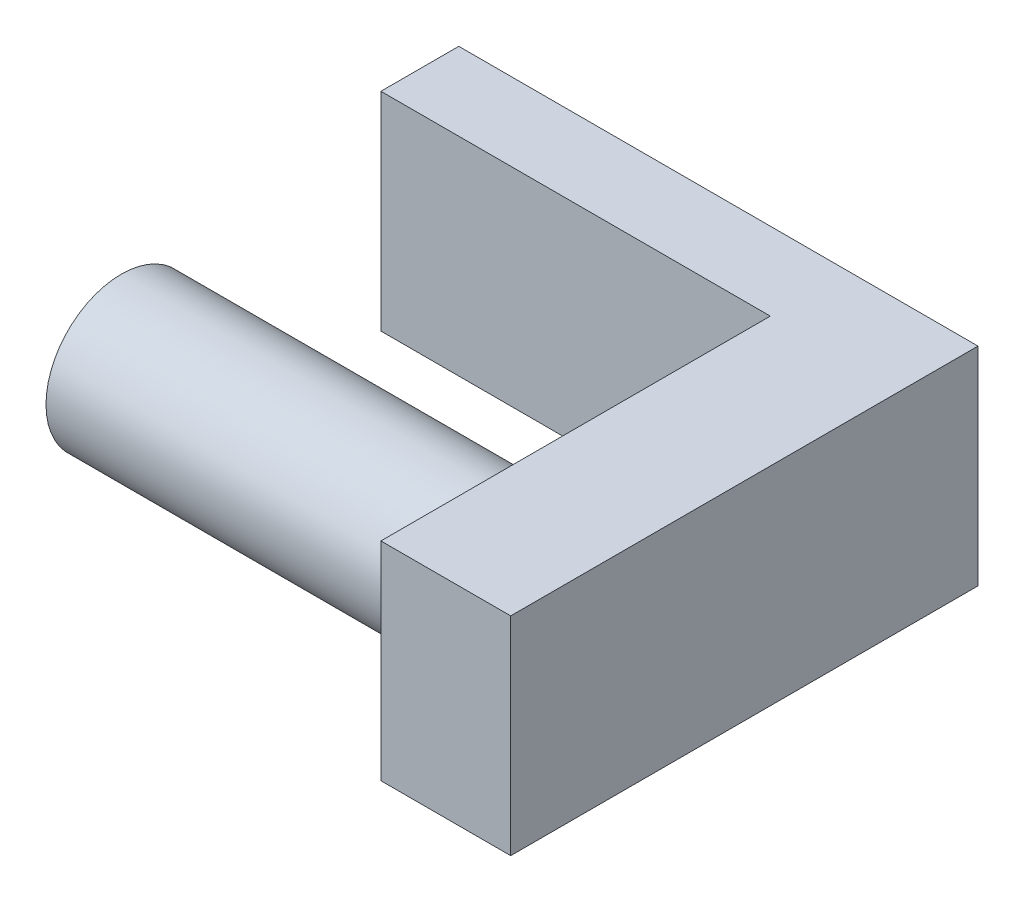
ISO-10303-21;
HEADER;
FILE_DESCRIPTION(('STEP AP214'),'2;1');
FILE_NAME('part.step','',(''),(''),'','','');
FILE_SCHEMA(('AUTOMOTIVE_DESIGN { 1 0 10303 214 1 1 1 1 }'));
ENDSEC;
DATA;
#1=APPLICATION_CONTEXT('core data for automotive mechanical design processes');
#2=APPLICATION_PROTOCOL_DEFINITION('international standard','automotive_design',2000,#1);
#3=PRODUCT_CONTEXT('',#1,'mechanical');
#4=PRODUCT('Part','Part','',(#3));
#5=PRODUCT_RELATED_PRODUCT_CATEGORY('part','',(#4));
#6=PRODUCT_DEFINITION_FORMATION('','',#4);
#7=PRODUCT_DEFINITION_CONTEXT('part definition',#1,'design');
#8=PRODUCT_DEFINITION('design','',#6,#7);
#9=PRODUCT_DEFINITION_SHAPE('','',#8);
#10=(LENGTH_UNIT() NAMED_UNIT(*) SI_UNIT(.MILLI.,.METRE.));
#11=(NAMED_UNIT(*) PLANE_ANGLE_UNIT() SI_UNIT($,.RADIAN.));
#12=(NAMED_UNIT(*) SI_UNIT($,.STERADIAN.) SOLID_ANGLE_UNIT());
#13=UNCERTAINTY_MEASURE_WITH_UNIT(LENGTH_MEASURE(1.E-05),#10,'distance_accuracy_value','');
#14=(GEOMETRIC_REPRESENTATION_CONTEXT(3) GLOBAL_UNCERTAINTY_ASSIGNED_CONTEXT((#13)) GLOBAL_UNIT_ASSIGNED_CONTEXT((#10,
#11,#12)) REPRESENTATION_CONTEXT('',''));
#15=CARTESIAN_POINT('',(0.,0.,0.));
#16=DIRECTION('',(0.,0.,1.));
#17=DIRECTION('',(1.,0.,0.));
#18=AXIS2_PLACEMENT_3D('',#15,#16,#17);
#19=CARTESIAN_POINT('',(0.,0.,3.));
#20=DIRECTION('',(0.,0.,-1.));
#21=DIRECTION('',(-1.,0.,0.));
#22=AXIS2_PLACEMENT_3D('',#19,#20,#21);
#23=PLANE('',#22);
#24=DIRECTION('',(0.,-1.,0.));
#25=VECTOR('',#24,1.);
#26=CARTESIAN_POINT('',(15.,8.,3.));
#27=LINE('',#26,#25);
#28=CARTESIAN_POINT('',(15.,8.,3.));
#29=VERTEX_POINT('',#28);
#30=CARTESIAN_POINT('',(15.,0.,3.));
#31=VERTEX_POINT('',#30);
#32=EDGE_CURVE('E52',#29,#31,#27,.T.);
#33=ORIENTED_EDGE('',*,*,#32,.F.);
#34=DIRECTION('',(-1.,0.,0.));
#35=VECTOR('',#34,1.);
#36=CARTESIAN_POINT('',(0.,8.,3.));
#37=LINE('',#36,#35);
#38=CARTESIAN_POINT('',(0.,8.,3.));
#39=VERTEX_POINT('',#38);
#40=EDGE_CURVE('E57',#29,#39,#37,.T.);
#41=ORIENTED_EDGE('',*,*,#40,.T.);
#42=DIRECTION('',(0.,-1.,0.));
#43=VECTOR('',#42,1.);
#44=CARTESIAN_POINT('',(0.,0.,3.));
#45=LINE('',#44,#43);
#46=CARTESIAN_POINT('',(0.,0.,3.));
#47=VERTEX_POINT('',#46);
#48=EDGE_CURVE('E88',#39,#47,#45,.T.);
#49=ORIENTED_EDGE('',*,*,#48,.T.);
#50=DIRECTION('',(1.,0.,0.));
#51=VECTOR('',#50,1.);
#52=CARTESIAN_POINT('',(0.,0.,3.));
#53=LINE('',#52,#51);
#54=EDGE_CURVE('E116',#47,#31,#53,.T.);
#55=ORIENTED_EDGE('',*,*,#54,.T.);
#56=EDGE_LOOP('',(#33,#41,#49,#55));
#57=FACE_BOUND('',#56,.T.);
#58=ADVANCED_FACE('F37',(#57),#23,.F.);
#59=CARTESIAN_POINT('',(0.,0.,3.));
#60=DIRECTION('',(1.,0.,0.));
#61=DIRECTION('',(0.,0.,-1.));
#62=AXIS2_PLACEMENT_3D('',#59,#60,#61);
#63=PLANE('',#62);
#64=DIRECTION('',(0.,-1.,0.));
#65=VECTOR('',#64,1.);
#66=CARTESIAN_POINT('',(0.,0.,0.));
#67=LINE('',#66,#65);
#68=CARTESIAN_POINT('',(0.,8.,0.));
#69=VERTEX_POINT('',#68);
#70=CARTESIAN_POINT('',(0.,0.,0.));
#71=VERTEX_POINT('',#70);
#72=EDGE_CURVE('E94',#69,#71,#67,.T.);
#73=ORIENTED_EDGE('',*,*,#72,.T.);
#74=DIRECTION('',(0.,0.,-1.));
#75=VECTOR('',#74,1.);
#76=CARTESIAN_POINT('',(0.,0.,3.));
#77=LINE('',#76,#75);
#78=EDGE_CURVE('E45',#47,#71,#77,.T.);
#79=ORIENTED_EDGE('',*,*,#78,.F.);
#80=ORIENTED_EDGE('',*,*,#48,.F.);
#81=DIRECTION('',(0.,0.,-1.));
#82=VECTOR('',#81,1.);
#83=CARTESIAN_POINT('',(0.,8.,3.));
#84=LINE('',#83,#82);
#85=EDGE_CURVE('E80',#39,#69,#84,.T.);
#86=ORIENTED_EDGE('',*,*,#85,.T.);
#87=EDGE_LOOP('',(#73,#79,#80,#86));
#88=FACE_BOUND('',#87,.T.);
#89=ADVANCED_FACE('F39',(#88),#63,.F.);
#90=CARTESIAN_POINT('',(0.,0.,3.));
#91=DIRECTION('',(0.,1.,0.));
#92=DIRECTION('',(0.,0.,1.));
#93=AXIS2_PLACEMENT_3D('',#90,#91,#92);
#94=PLANE('',#93);
#95=DIRECTION('',(1.,0.,0.));
#96=VECTOR('',#95,1.);
#97=CARTESIAN_POINT('',(0.,0.,0.));
#98=LINE('',#97,#96);
#99=CARTESIAN_POINT('',(20.,0.,0.));
#100=VERTEX_POINT('',#99);
#101=EDGE_CURVE('E97',#71,#100,#98,.T.);
#102=ORIENTED_EDGE('',*,*,#101,.T.);
#103=DIRECTION('',(0.,0.,-1.));
#104=VECTOR('',#103,1.);
#105=CARTESIAN_POINT('',(20.,0.,3.));
#106=LINE('',#105,#104);
#107=CARTESIAN_POINT('',(20.,0.,18.));
#108=VERTEX_POINT('',#107);
#109=EDGE_CURVE('E110',#108,#100,#106,.T.);
#110=ORIENTED_EDGE('',*,*,#109,.F.);
#111=DIRECTION('',(1.,0.,0.));
#112=VECTOR('',#111,1.);
#113=CARTESIAN_POINT('',(20.,0.,18.));
#114=LINE('',#113,#112);
#115=CARTESIAN_POINT('',(15.,0.,18.));
#116=VERTEX_POINT('',#115);
#117=EDGE_CURVE('E123',#116,#108,#114,.T.);
#118=ORIENTED_EDGE('',*,*,#117,.F.);
#119=DIRECTION('',(0.,0.,-1.));
#120=VECTOR('',#119,1.);
#121=CARTESIAN_POINT('',(15.,0.,18.));
#122=LINE('',#121,#120);
#123=EDGE_CURVE('E103',#116,#31,#122,.T.);
#124=ORIENTED_EDGE('',*,*,#123,.T.);
#125=ORIENTED_EDGE('',*,*,#54,.F.);
#126=ORIENTED_EDGE('',*,*,#78,.T.);
#127=EDGE_LOOP('',(#102,#110,#118,#124,#125,#126));
#128=FACE_BOUND('',#127,.T.);
#129=ADVANCED_FACE('F113',(#128),#94,.F.);
#130=CARTESIAN_POINT('',(20.,0.,3.));
#131=DIRECTION('',(-1.,0.,0.));
#132=DIRECTION('',(0.,0.,1.));
#133=AXIS2_PLACEMENT_3D('',#130,#131,#132);
#134=PLANE('',#133);
#135=DIRECTION('',(0.,1.,0.));
#136=VECTOR('',#135,1.);
#137=CARTESIAN_POINT('',(20.,0.,0.));
#138=LINE('',#137,#136);
#139=CARTESIAN_POINT('',(20.,8.,0.));
#140=VERTEX_POINT('',#139);
#141=EDGE_CURVE('E89',#100,#140,#138,.T.);
#142=ORIENTED_EDGE('',*,*,#141,.T.);
#143=DIRECTION('',(0.,0.,-1.));
#144=VECTOR('',#143,1.);
#145=CARTESIAN_POINT('',(20.,8.,3.));
#146=LINE('',#145,#144);
#147=CARTESIAN_POINT('',(20.,8.,18.));
#148=VERTEX_POINT('',#147);
#149=EDGE_CURVE('E84',#148,#140,#146,.T.);
#150=ORIENTED_EDGE('',*,*,#149,.F.);
#151=DIRECTION('',(0.,1.,0.));
#152=VECTOR('',#151,1.);
#153=CARTESIAN_POINT('',(20.,8.,18.));
#154=LINE('',#153,#152);
#155=EDGE_CURVE('E125',#108,#148,#154,.T.);
#156=ORIENTED_EDGE('',*,*,#155,.F.);
#157=ORIENTED_EDGE('',*,*,#109,.T.);
#158=EDGE_LOOP('',(#142,#150,#156,#157));
#159=FACE_BOUND('',#158,.T.);
#160=ADVANCED_FACE('F165',(#159),#134,.F.);
#161=CARTESIAN_POINT('',(0.,8.,3.));
#162=DIRECTION('',(0.,-1.,0.));
#163=DIRECTION('',(0.,0.,-1.));
#164=AXIS2_PLACEMENT_3D('',#161,#162,#163);
#165=PLANE('',#164);
#166=DIRECTION('',(-1.,0.,0.));
#167=VECTOR('',#166,1.);
#168=CARTESIAN_POINT('',(0.,8.,0.));
#169=LINE('',#168,#167);
#170=EDGE_CURVE('E77',#140,#69,#169,.T.);
#171=ORIENTED_EDGE('',*,*,#170,.T.);
#172=ORIENTED_EDGE('',*,*,#85,.F.);
#173=ORIENTED_EDGE('',*,*,#40,.F.);
#174=DIRECTION('',(0.,0.,-1.));
#175=VECTOR('',#174,1.);
#176=CARTESIAN_POINT('',(15.,8.,18.));
#177=LINE('',#176,#175);
#178=CARTESIAN_POINT('',(15.,8.,18.));
#179=VERTEX_POINT('',#178);
#180=EDGE_CURVE('E99',#179,#29,#177,.T.);
#181=ORIENTED_EDGE('',*,*,#180,.F.);
#182=DIRECTION('',(-1.,0.,0.));
#183=VECTOR('',#182,1.);
#184=CARTESIAN_POINT('',(20.,8.,18.));
#185=LINE('',#184,#183);
#186=EDGE_CURVE('E132',#148,#179,#185,.T.);
#187=ORIENTED_EDGE('',*,*,#186,.F.);
#188=ORIENTED_EDGE('',*,*,#149,.T.);
#189=EDGE_LOOP('',(#171,#172,#173,#181,#187,#188));
#190=FACE_BOUND('',#189,.T.);
#191=ADVANCED_FACE('F79',(#190),#165,.F.);
#192=CARTESIAN_POINT('',(0.,0.,0.));
#193=DIRECTION('',(0.,0.,-1.));
#194=DIRECTION('',(-1.,0.,0.));
#195=AXIS2_PLACEMENT_3D('',#192,#193,#194);
#196=PLANE('',#195);
#197=ORIENTED_EDGE('',*,*,#72,.F.);
#198=ORIENTED_EDGE('',*,*,#170,.F.);
#199=ORIENTED_EDGE('',*,*,#141,.F.);
#200=ORIENTED_EDGE('',*,*,#101,.F.);
#201=EDGE_LOOP('',(#197,#198,#199,#200));
#202=FACE_BOUND('',#201,.T.);
#203=ADVANCED_FACE('F96',(#202),#196,.T.);
#204=CARTESIAN_POINT('',(15.,8.,18.));
#205=DIRECTION('',(1.,0.,0.));
#206=DIRECTION('',(0.,1.,0.));
#207=AXIS2_PLACEMENT_3D('',#204,#205,#206);
#208=PLANE('',#207);
#209=CARTESIAN_POINT('',(15.,4.,13.));
#210=DIRECTION('',(1.,0.,0.));
#211=DIRECTION('',(0.,1.,0.));
#212=AXIS2_PLACEMENT_3D('',#209,#210,#211);
#213=CIRCLE('',#212,2.9);
#214=CARTESIAN_POINT('',(15.,6.9,13.));
#215=VERTEX_POINT('',#214);
#216=EDGE_CURVE('E11',#215,#215,#213,.F.);
#217=ORIENTED_EDGE('',*,*,#216,.F.);
#218=EDGE_LOOP('',(#217));
#219=FACE_BOUND('',#218,.T.);
#220=ORIENTED_EDGE('',*,*,#32,.T.);
#221=ORIENTED_EDGE('',*,*,#123,.F.);
#222=DIRECTION('',(0.,-1.,0.));
#223=VECTOR('',#222,1.);
#224=CARTESIAN_POINT('',(15.,8.,18.));
#225=LINE('',#224,#223);
#226=EDGE_CURVE('E129',#179,#116,#225,.T.);
#227=ORIENTED_EDGE('',*,*,#226,.F.);
#228=ORIENTED_EDGE('',*,*,#180,.T.);
#229=EDGE_LOOP('',(#220,#221,#227,#228));
#230=FACE_BOUND('',#229,.T.);
#231=ADVANCED_FACE('F149',(#219,#230),#208,.F.);
#232=CARTESIAN_POINT('',(0.,0.,18.));
#233=DIRECTION('',(0.,0.,-1.));
#234=DIRECTION('',(-1.,0.,0.));
#235=AXIS2_PLACEMENT_3D('',#232,#233,#234);
#236=PLANE('',#235);
#237=ORIENTED_EDGE('',*,*,#155,.T.);
#238=ORIENTED_EDGE('',*,*,#186,.T.);
#239=ORIENTED_EDGE('',*,*,#226,.T.);
#240=ORIENTED_EDGE('',*,*,#117,.T.);
#241=EDGE_LOOP('',(#237,#238,#239,#240));
#242=FACE_BOUND('',#241,.T.);
#243=ADVANCED_FACE('F145',(#242),#236,.F.);
#244=CARTESIAN_POINT('',(0.,4.00000000000001,13.));
#245=DIRECTION('',(1.,0.,0.));
#246=DIRECTION('',(0.,1.,0.));
#247=AXIS2_PLACEMENT_3D('',#244,#245,#246);
#248=CYLINDRICAL_SURFACE('',#247,2.9);
#249=CARTESIAN_POINT('',(0.,4.00000000000001,13.));
#250=DIRECTION('',(-1.,0.,0.));
#251=DIRECTION('',(0.,-1.,0.));
#252=AXIS2_PLACEMENT_3D('',#249,#250,#251);
#253=CIRCLE('',#252,2.9);
#254=CARTESIAN_POINT('',(0.,1.10000000000001,13.));
#255=VERTEX_POINT('',#254);
#256=EDGE_CURVE('E126',#255,#255,#253,.T.);
#257=ORIENTED_EDGE('',*,*,#256,.F.);
#258=EDGE_LOOP('',(#257));
#259=FACE_BOUND('',#258,.T.);
#260=ORIENTED_EDGE('',*,*,#216,.T.);
#261=EDGE_LOOP('',(#260));
#262=FACE_BOUND('',#261,.T.);
#263=ADVANCED_FACE('F142',(#259,#262),#248,.T.);
#264=CARTESIAN_POINT('',(0.,4.00000000000001,13.));
#265=DIRECTION('',(-1.,0.,0.));
#266=DIRECTION('',(0.,-1.,0.));
#267=AXIS2_PLACEMENT_3D('',#264,#265,#266);
#268=PLANE('',#267);
#269=ORIENTED_EDGE('',*,*,#256,.T.);
#270=EDGE_LOOP('',(#269));
#271=FACE_BOUND('',#270,.T.);
#272=ADVANCED_FACE('F140',(#271),#268,.T.);
#273=CLOSED_SHELL('',(#58,#89,#129,#160,#191,#203,#231,#243,#263,#272));
#274=MANIFOLD_SOLID_BREP('B2',#273);
#275=ADVANCED_BREP_SHAPE_REPRESENTATION('',(#18,#274),#14);
#276=SHAPE_DEFINITION_REPRESENTATION(#9,#275);
ENDSEC;
END-ISO-10303-21;
